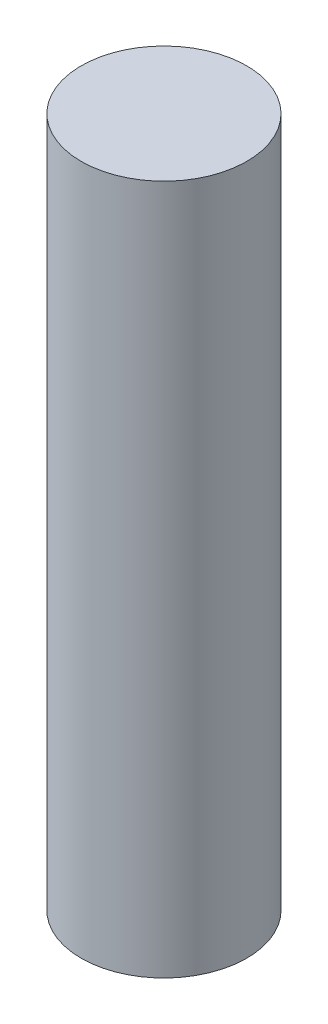
ISO-10303-21;
HEADER;
FILE_DESCRIPTION(('STEP AP214'),'2;1');
FILE_NAME('part.step','',(''),(''),'','','');
FILE_SCHEMA(('AUTOMOTIVE_DESIGN { 1 0 10303 214 1 1 1 1 }'));
ENDSEC;
DATA;
#1=APPLICATION_CONTEXT('core data for automotive mechanical design processes');
#2=APPLICATION_PROTOCOL_DEFINITION('international standard','automotive_design',2000,#1);
#3=PRODUCT_CONTEXT('',#1,'mechanical');
#4=PRODUCT('Part','Part','',(#3));
#5=PRODUCT_RELATED_PRODUCT_CATEGORY('part','',(#4));
#6=PRODUCT_DEFINITION_FORMATION('','',#4);
#7=PRODUCT_DEFINITION_CONTEXT('part definition',#1,'design');
#8=PRODUCT_DEFINITION('design','',#6,#7);
#9=PRODUCT_DEFINITION_SHAPE('','',#8);
#10=(LENGTH_UNIT() NAMED_UNIT(*) SI_UNIT(.MILLI.,.METRE.));
#11=(NAMED_UNIT(*) PLANE_ANGLE_UNIT() SI_UNIT($,.RADIAN.));
#12=(NAMED_UNIT(*) SI_UNIT($,.STERADIAN.) SOLID_ANGLE_UNIT());
#13=UNCERTAINTY_MEASURE_WITH_UNIT(LENGTH_MEASURE(1.E-05),#10,'distance_accuracy_value','');
#14=(GEOMETRIC_REPRESENTATION_CONTEXT(3) GLOBAL_UNCERTAINTY_ASSIGNED_CONTEXT((#13)) GLOBAL_UNIT_ASSIGNED_CONTEXT((#10,
#11,#12)) REPRESENTATION_CONTEXT('',''));
#15=CARTESIAN_POINT('',(0.,0.,0.));
#16=DIRECTION('',(0.,0.,1.));
#17=DIRECTION('',(1.,0.,0.));
#18=AXIS2_PLACEMENT_3D('',#15,#16,#17);
#19=CARTESIAN_POINT('',(0.,12.5,0.));
#20=DIRECTION('',(0.,-1.,0.));
#21=DIRECTION('',(0.,0.,-1.));
#22=AXIS2_PLACEMENT_3D('',#19,#20,#21);
#23=CYLINDRICAL_SURFACE('',#22,1.5);
#24=CARTESIAN_POINT('',(0.,12.5,0.));
#25=DIRECTION('',(0.,1.,0.));
#26=DIRECTION('',(0.,0.,1.));
#27=AXIS2_PLACEMENT_3D('',#24,#25,#26);
#28=CIRCLE('',#27,1.5);
#29=CARTESIAN_POINT('',(0.,12.5,1.5));
#30=VERTEX_POINT('',#29);
#31=EDGE_CURVE('E10',#30,#30,#28,.T.);
#32=ORIENTED_EDGE('',*,*,#31,.F.);
#33=EDGE_LOOP('',(#32));
#34=FACE_BOUND('',#33,.T.);
#35=CARTESIAN_POINT('',(0.,0.,0.));
#36=DIRECTION('',(0.,1.,0.));
#37=DIRECTION('',(0.,0.,1.));
#38=AXIS2_PLACEMENT_3D('',#35,#36,#37);
#39=CIRCLE('',#38,1.5);
#40=CARTESIAN_POINT('',(0.,0.,1.5));
#41=VERTEX_POINT('',#40);
#42=EDGE_CURVE('E40',#41,#41,#39,.T.);
#43=ORIENTED_EDGE('',*,*,#42,.T.);
#44=EDGE_LOOP('',(#43));
#45=FACE_BOUND('',#44,.T.);
#46=ADVANCED_FACE('F37',(#34,#45),#23,.T.);
#47=CARTESIAN_POINT('',(0.,12.5,0.));
#48=DIRECTION('',(0.,1.,0.));
#49=DIRECTION('',(0.,0.,1.));
#50=AXIS2_PLACEMENT_3D('',#47,#48,#49);
#51=PLANE('',#50);
#52=ORIENTED_EDGE('',*,*,#31,.T.);
#53=EDGE_LOOP('',(#52));
#54=FACE_BOUND('',#53,.T.);
#55=ADVANCED_FACE('F52',(#54),#51,.T.);
#56=CARTESIAN_POINT('',(0.,0.,0.));
#57=DIRECTION('',(0.,1.,0.));
#58=DIRECTION('',(0.,0.,1.));
#59=AXIS2_PLACEMENT_3D('',#56,#57,#58);
#60=PLANE('',#59);
#61=ORIENTED_EDGE('',*,*,#42,.F.);
#62=EDGE_LOOP('',(#61));
#63=FACE_BOUND('',#62,.T.);
#64=ADVANCED_FACE('F50',(#63),#60,.F.);
#65=CLOSED_SHELL('',(#46,#55,#64));
#66=MANIFOLD_SOLID_BREP('B2',#65);
#67=ADVANCED_BREP_SHAPE_REPRESENTATION('',(#18,#66),#14);
#68=SHAPE_DEFINITION_REPRESENTATION(#9,#67);
ENDSEC;
END-ISO-10303-21;
